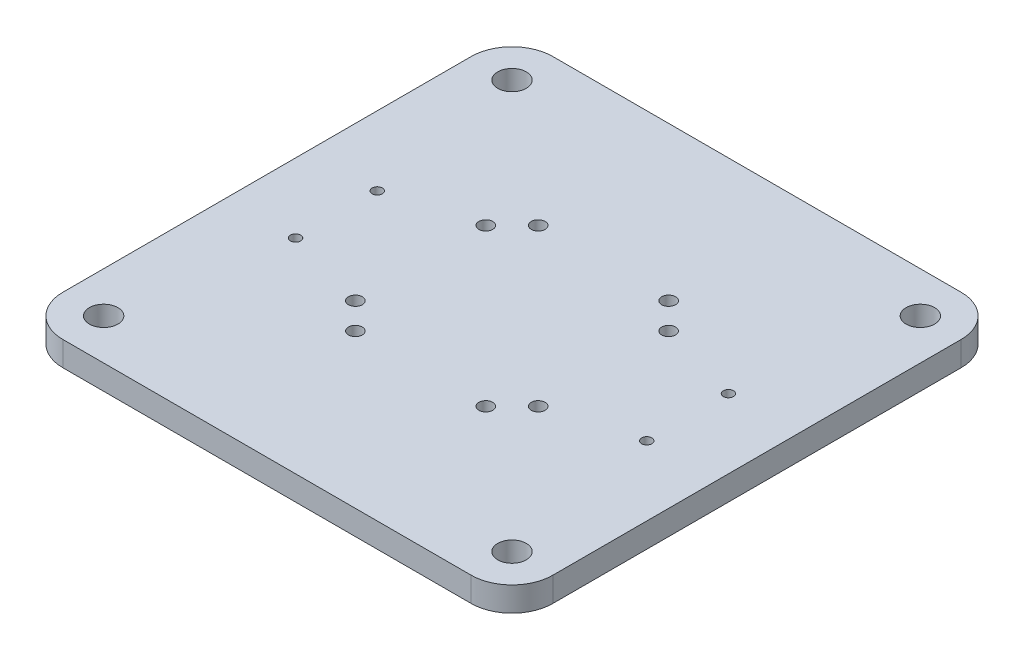
ISO-10303-21;
HEADER;
FILE_DESCRIPTION(('STEP AP214'),'2;1');
FILE_NAME('part.step','',(''),(''),'','','');
FILE_SCHEMA(('AUTOMOTIVE_DESIGN { 1 0 10303 214 1 1 1 1 }'));
ENDSEC;
DATA;
#1=APPLICATION_CONTEXT('core data for automotive mechanical design processes');
#2=APPLICATION_PROTOCOL_DEFINITION('international standard','automotive_design',2000,#1);
#3=PRODUCT_CONTEXT('',#1,'mechanical');
#4=PRODUCT('Part','Part','',(#3));
#5=PRODUCT_RELATED_PRODUCT_CATEGORY('part','',(#4));
#6=PRODUCT_DEFINITION_FORMATION('','',#4);
#7=PRODUCT_DEFINITION_CONTEXT('part definition',#1,'design');
#8=PRODUCT_DEFINITION('design','',#6,#7);
#9=PRODUCT_DEFINITION_SHAPE('','',#8);
#10=(LENGTH_UNIT() NAMED_UNIT(*) SI_UNIT(.MILLI.,.METRE.));
#11=(NAMED_UNIT(*) PLANE_ANGLE_UNIT() SI_UNIT($,.RADIAN.));
#12=(NAMED_UNIT(*) SI_UNIT($,.STERADIAN.) SOLID_ANGLE_UNIT());
#13=UNCERTAINTY_MEASURE_WITH_UNIT(LENGTH_MEASURE(1.E-05),#10,'distance_accuracy_value','');
#14=(GEOMETRIC_REPRESENTATION_CONTEXT(3) GLOBAL_UNCERTAINTY_ASSIGNED_CONTEXT((#13)) GLOBAL_UNIT_ASSIGNED_CONTEXT((#10,
#11,#12)) REPRESENTATION_CONTEXT('',''));
#15=CARTESIAN_POINT('',(0.,0.,0.));
#16=DIRECTION('',(0.,0.,1.));
#17=DIRECTION('',(1.,0.,0.));
#18=AXIS2_PLACEMENT_3D('',#15,#16,#17);
#19=CARTESIAN_POINT('',(0.,0.,0.));
#20=DIRECTION('',(0.,1.,0.));
#21=DIRECTION('',(0.,0.,1.));
#22=AXIS2_PLACEMENT_3D('',#19,#20,#21);
#23=PLANE('',#22);
#24=CARTESIAN_POINT('',(-43.,0.,10.));
#25=DIRECTION('',(0.,1.,0.));
#26=DIRECTION('',(0.,0.,1.));
#27=AXIS2_PLACEMENT_3D('',#24,#25,#26);
#28=CIRCLE('',#27,1.24999999999999);
#29=CARTESIAN_POINT('',(-43.,0.,11.25));
#30=VERTEX_POINT('',#29);
#31=EDGE_CURVE('E295',#30,#30,#28,.F.);
#32=ORIENTED_EDGE('',*,*,#31,.F.);
#33=EDGE_LOOP('',(#32));
#34=FACE_BOUND('',#33,.T.);
#35=CARTESIAN_POINT('',(43.,0.,-10.));
#36=DIRECTION('',(0.,1.,0.));
#37=DIRECTION('',(0.,0.,1.));
#38=AXIS2_PLACEMENT_3D('',#35,#36,#37);
#39=CIRCLE('',#38,1.24999999999999);
#40=CARTESIAN_POINT('',(43.,0.,-8.75000000000001));
#41=VERTEX_POINT('',#40);
#42=EDGE_CURVE('E283',#41,#41,#39,.F.);
#43=ORIENTED_EDGE('',*,*,#42,.F.);
#44=EDGE_LOOP('',(#43));
#45=FACE_BOUND('',#44,.T.);
#46=CARTESIAN_POINT('',(22.3881767547989,0.,15.9693312820506));
#47=DIRECTION('',(0.,-1.,0.));
#48=DIRECTION('',(0.,0.,-1.));
#49=AXIS2_PLACEMENT_3D('',#46,#47,#48);
#50=CIRCLE('',#49,3.3);
#51=CARTESIAN_POINT('',(22.3881767547989,0.,12.6693312820506));
#52=VERTEX_POINT('',#51);
#53=EDGE_CURVE('E258',#52,#52,#50,.T.);
#54=ORIENTED_EDGE('',*,*,#53,.F.);
#55=EDGE_LOOP('',(#54));
#56=FACE_BOUND('',#55,.T.);
#57=CARTESIAN_POINT('',(-22.3881767547988,0.,15.9693312820508));
#58=DIRECTION('',(0.,-1.,0.));
#59=DIRECTION('',(0.,0.,-1.));
#60=AXIS2_PLACEMENT_3D('',#57,#58,#59);
#61=CIRCLE('',#60,3.3);
#62=CARTESIAN_POINT('',(-22.3881767547988,0.,12.6693312820508));
#63=VERTEX_POINT('',#62);
#64=EDGE_CURVE('E231',#63,#63,#61,.T.);
#65=ORIENTED_EDGE('',*,*,#64,.F.);
#66=EDGE_LOOP('',(#65));
#67=FACE_BOUND('',#66,.T.);
#68=CARTESIAN_POINT('',(-50.,0.,50.));
#69=DIRECTION('',(0.,1.,0.));
#70=DIRECTION('',(0.,0.,1.));
#71=AXIS2_PLACEMENT_3D('',#68,#69,#70);
#72=CIRCLE('',#71,3.5);
#73=CARTESIAN_POINT('',(-50.,0.,53.5));
#74=VERTEX_POINT('',#73);
#75=EDGE_CURVE('E134',#74,#74,#72,.T.);
#76=ORIENTED_EDGE('',*,*,#75,.T.);
#77=EDGE_LOOP('',(#76));
#78=FACE_BOUND('',#77,.T.);
#79=CARTESIAN_POINT('',(50.,0.,50.));
#80=DIRECTION('',(0.,1.,0.));
#81=DIRECTION('',(0.,0.,1.));
#82=AXIS2_PLACEMENT_3D('',#79,#80,#81);
#83=CIRCLE('',#82,3.5);
#84=CARTESIAN_POINT('',(50.,0.,53.5));
#85=VERTEX_POINT('',#84);
#86=EDGE_CURVE('E140',#85,#85,#83,.T.);
#87=ORIENTED_EDGE('',*,*,#86,.T.);
#88=EDGE_LOOP('',(#87));
#89=FACE_BOUND('',#88,.T.);
#90=CARTESIAN_POINT('',(50.,0.,-50.));
#91=DIRECTION('',(0.,1.,0.));
#92=DIRECTION('',(0.,0.,1.));
#93=AXIS2_PLACEMENT_3D('',#90,#91,#92);
#94=CIRCLE('',#93,3.5);
#95=CARTESIAN_POINT('',(50.,0.,-46.5));
#96=VERTEX_POINT('',#95);
#97=EDGE_CURVE('E152',#96,#96,#94,.T.);
#98=ORIENTED_EDGE('',*,*,#97,.T.);
#99=EDGE_LOOP('',(#98));
#100=FACE_BOUND('',#99,.T.);
#101=CARTESIAN_POINT('',(-50.,0.,-50.));
#102=DIRECTION('',(0.,1.,0.));
#103=DIRECTION('',(0.,0.,1.));
#104=AXIS2_PLACEMENT_3D('',#101,#102,#103);
#105=CIRCLE('',#104,3.5);
#106=CARTESIAN_POINT('',(-50.,0.,-46.5));
#107=VERTEX_POINT('',#106);
#108=EDGE_CURVE('E149',#107,#107,#105,.T.);
#109=ORIENTED_EDGE('',*,*,#108,.T.);
#110=EDGE_LOOP('',(#109));
#111=FACE_BOUND('',#110,.T.);
#112=DIRECTION('',(0.,0.,-1.));
#113=VECTOR('',#112,1.);
#114=CARTESIAN_POINT('',(60.,0.,-60.));
#115=LINE('',#114,#113);
#116=CARTESIAN_POINT('',(60.,0.,50.));
#117=VERTEX_POINT('',#116);
#118=CARTESIAN_POINT('',(60.,0.,-50.));
#119=VERTEX_POINT('',#118);
#120=EDGE_CURVE('E124',#117,#119,#115,.T.);
#121=ORIENTED_EDGE('',*,*,#120,.F.);
#122=CARTESIAN_POINT('',(50.,0.,50.));
#123=DIRECTION('',(0.,1.,0.));
#124=DIRECTION('',(0.,0.,1.));
#125=AXIS2_PLACEMENT_3D('',#122,#123,#124);
#126=CIRCLE('',#125,10.);
#127=CARTESIAN_POINT('',(50.,0.,60.));
#128=VERTEX_POINT('',#127);
#129=EDGE_CURVE('E107',#117,#128,#126,.F.);
#130=ORIENTED_EDGE('',*,*,#129,.T.);
#131=DIRECTION('',(1.,0.,0.));
#132=VECTOR('',#131,1.);
#133=CARTESIAN_POINT('',(-60.,0.,60.));
#134=LINE('',#133,#132);
#135=CARTESIAN_POINT('',(-50.,0.,60.));
#136=VERTEX_POINT('',#135);
#137=EDGE_CURVE('E147',#136,#128,#134,.T.);
#138=ORIENTED_EDGE('',*,*,#137,.F.);
#139=CARTESIAN_POINT('',(-50.,0.,50.));
#140=DIRECTION('',(0.,1.,0.));
#141=DIRECTION('',(0.,0.,1.));
#142=AXIS2_PLACEMENT_3D('',#139,#140,#141);
#143=CIRCLE('',#142,10.);
#144=CARTESIAN_POINT('',(-60.,0.,50.));
#145=VERTEX_POINT('',#144);
#146=EDGE_CURVE('E118',#136,#145,#143,.F.);
#147=ORIENTED_EDGE('',*,*,#146,.T.);
#148=DIRECTION('',(0.,0.,1.));
#149=VECTOR('',#148,1.);
#150=CARTESIAN_POINT('',(-60.,0.,-60.));
#151=LINE('',#150,#149);
#152=CARTESIAN_POINT('',(-60.,0.,-50.));
#153=VERTEX_POINT('',#152);
#154=EDGE_CURVE('E137',#153,#145,#151,.T.);
#155=ORIENTED_EDGE('',*,*,#154,.F.);
#156=CARTESIAN_POINT('',(-50.,0.,-50.));
#157=DIRECTION('',(0.,1.,0.));
#158=DIRECTION('',(0.,0.,1.));
#159=AXIS2_PLACEMENT_3D('',#156,#157,#158);
#160=CIRCLE('',#159,10.);
#161=CARTESIAN_POINT('',(-50.,0.,-60.));
#162=VERTEX_POINT('',#161);
#163=EDGE_CURVE('E160',#153,#162,#160,.F.);
#164=ORIENTED_EDGE('',*,*,#163,.T.);
#165=DIRECTION('',(-1.,0.,0.));
#166=VECTOR('',#165,1.);
#167=CARTESIAN_POINT('',(-60.,0.,-60.));
#168=LINE('',#167,#166);
#169=CARTESIAN_POINT('',(50.,0.,-60.));
#170=VERTEX_POINT('',#169);
#171=EDGE_CURVE('E133',#170,#162,#168,.T.);
#172=ORIENTED_EDGE('',*,*,#171,.F.);
#173=CARTESIAN_POINT('',(50.,0.,-50.));
#174=DIRECTION('',(0.,1.,0.));
#175=DIRECTION('',(0.,0.,1.));
#176=AXIS2_PLACEMENT_3D('',#173,#174,#175);
#177=CIRCLE('',#176,10.);
#178=EDGE_CURVE('E128',#170,#119,#177,.F.);
#179=ORIENTED_EDGE('',*,*,#178,.T.);
#180=EDGE_LOOP('',(#121,#130,#138,#147,#155,#164,#172,#179));
#181=FACE_BOUND('',#180,.T.);
#182=CARTESIAN_POINT('',(-15.969331282051,0.,-22.3881767547986));
#183=DIRECTION('',(0.,-1.,0.));
#184=DIRECTION('',(0.,0.,-1.));
#185=AXIS2_PLACEMENT_3D('',#182,#183,#184);
#186=CIRCLE('',#185,3.3);
#187=CARTESIAN_POINT('',(-15.969331282051,0.,-25.6881767547986));
#188=VERTEX_POINT('',#187);
#189=EDGE_CURVE('E213',#188,#188,#186,.T.);
#190=ORIENTED_EDGE('',*,*,#189,.F.);
#191=EDGE_LOOP('',(#190));
#192=FACE_BOUND('',#191,.T.);
#193=CARTESIAN_POINT('',(-22.3881767547989,0.,-15.9693312820506));
#194=DIRECTION('',(0.,-1.,0.));
#195=DIRECTION('',(0.,0.,-1.));
#196=AXIS2_PLACEMENT_3D('',#193,#194,#195);
#197=CIRCLE('',#196,3.3);
#198=CARTESIAN_POINT('',(-22.3881767547989,0.,-19.2693312820506));
#199=VERTEX_POINT('',#198);
#200=EDGE_CURVE('E222',#199,#199,#197,.T.);
#201=ORIENTED_EDGE('',*,*,#200,.F.);
#202=EDGE_LOOP('',(#201));
#203=FACE_BOUND('',#202,.T.);
#204=CARTESIAN_POINT('',(-15.9693312820508,0.,22.3881767547988));
#205=DIRECTION('',(0.,-1.,0.));
#206=DIRECTION('',(0.,0.,-1.));
#207=AXIS2_PLACEMENT_3D('',#204,#205,#206);
#208=CIRCLE('',#207,3.3);
#209=CARTESIAN_POINT('',(-15.9693312820508,0.,19.0881767547988));
#210=VERTEX_POINT('',#209);
#211=EDGE_CURVE('E240',#210,#210,#208,.T.);
#212=ORIENTED_EDGE('',*,*,#211,.F.);
#213=EDGE_LOOP('',(#212));
#214=FACE_BOUND('',#213,.T.);
#215=CARTESIAN_POINT('',(15.969331282051,0.,22.3881767547986));
#216=DIRECTION('',(0.,-1.,0.));
#217=DIRECTION('',(0.,0.,-1.));
#218=AXIS2_PLACEMENT_3D('',#215,#216,#217);
#219=CIRCLE('',#218,3.3);
#220=CARTESIAN_POINT('',(15.969331282051,0.,19.0881767547986));
#221=VERTEX_POINT('',#220);
#222=EDGE_CURVE('E249',#221,#221,#219,.T.);
#223=ORIENTED_EDGE('',*,*,#222,.F.);
#224=EDGE_LOOP('',(#223));
#225=FACE_BOUND('',#224,.T.);
#226=CARTESIAN_POINT('',(22.3881767547988,0.,-15.9693312820508));
#227=DIRECTION('',(0.,-1.,0.));
#228=DIRECTION('',(0.,0.,-1.));
#229=AXIS2_PLACEMENT_3D('',#226,#227,#228);
#230=CIRCLE('',#229,3.3);
#231=CARTESIAN_POINT('',(22.3881767547988,0.,-19.2693312820508));
#232=VERTEX_POINT('',#231);
#233=EDGE_CURVE('E267',#232,#232,#230,.T.);
#234=ORIENTED_EDGE('',*,*,#233,.F.);
#235=EDGE_LOOP('',(#234));
#236=FACE_BOUND('',#235,.T.);
#237=CARTESIAN_POINT('',(15.9693312820508,0.,-22.3881767547988));
#238=DIRECTION('',(0.,-1.,0.));
#239=DIRECTION('',(0.,0.,-1.));
#240=AXIS2_PLACEMENT_3D('',#237,#238,#239);
#241=CIRCLE('',#240,3.3);
#242=CARTESIAN_POINT('',(15.9693312820508,0.,-25.6881767547988));
#243=VERTEX_POINT('',#242);
#244=EDGE_CURVE('E276',#243,#243,#241,.T.);
#245=ORIENTED_EDGE('',*,*,#244,.F.);
#246=EDGE_LOOP('',(#245));
#247=FACE_BOUND('',#246,.T.);
#248=CARTESIAN_POINT('',(43.,0.,10.));
#249=DIRECTION('',(0.,1.,0.));
#250=DIRECTION('',(0.,0.,1.));
#251=AXIS2_PLACEMENT_3D('',#248,#249,#250);
#252=CIRCLE('',#251,1.24999999999999);
#253=CARTESIAN_POINT('',(43.,0.,11.25));
#254=VERTEX_POINT('',#253);
#255=EDGE_CURVE('E279',#254,#254,#252,.F.);
#256=ORIENTED_EDGE('',*,*,#255,.F.);
#257=EDGE_LOOP('',(#256));
#258=FACE_BOUND('',#257,.T.);
#259=CARTESIAN_POINT('',(-43.,0.,-10.));
#260=DIRECTION('',(0.,1.,0.));
#261=DIRECTION('',(0.,0.,1.));
#262=AXIS2_PLACEMENT_3D('',#259,#260,#261);
#263=CIRCLE('',#262,1.24999999999999);
#264=CARTESIAN_POINT('',(-43.,0.,-8.75000000000001));
#265=VERTEX_POINT('',#264);
#266=EDGE_CURVE('E289',#265,#265,#263,.F.);
#267=ORIENTED_EDGE('',*,*,#266,.F.);
#268=EDGE_LOOP('',(#267));
#269=FACE_BOUND('',#268,.T.);
#270=ADVANCED_FACE('F41',(#34,#45,#56,#67,#78,#89,#100,#111,#181,#192,#203,#214,#225,#236,#247,
#258,#269),#23,.F.);
#271=CARTESIAN_POINT('',(60.,6.,-60.));
#272=DIRECTION('',(-1.,0.,0.));
#273=DIRECTION('',(0.,0.,1.));
#274=AXIS2_PLACEMENT_3D('',#271,#272,#273);
#275=PLANE('',#274);
#276=DIRECTION('',(0.,0.,-1.));
#277=VECTOR('',#276,1.);
#278=CARTESIAN_POINT('',(60.,6.,-60.));
#279=LINE('',#278,#277);
#280=CARTESIAN_POINT('',(60.,6.,50.));
#281=VERTEX_POINT('',#280);
#282=CARTESIAN_POINT('',(60.,6.,-50.));
#283=VERTEX_POINT('',#282);
#284=EDGE_CURVE('E127',#281,#283,#279,.T.);
#285=ORIENTED_EDGE('',*,*,#284,.F.);
#286=DIRECTION('',(0.,-1.,0.));
#287=VECTOR('',#286,1.);
#288=CARTESIAN_POINT('',(60.,6.,50.));
#289=LINE('',#288,#287);
#290=EDGE_CURVE('E111',#281,#117,#289,.T.);
#291=ORIENTED_EDGE('',*,*,#290,.T.);
#292=ORIENTED_EDGE('',*,*,#120,.T.);
#293=DIRECTION('',(0.,-1.,0.));
#294=VECTOR('',#293,1.);
#295=CARTESIAN_POINT('',(60.,6.,-50.));
#296=LINE('',#295,#294);
#297=EDGE_CURVE('E129',#119,#283,#296,.F.);
#298=ORIENTED_EDGE('',*,*,#297,.T.);
#299=EDGE_LOOP('',(#285,#291,#292,#298));
#300=FACE_BOUND('',#299,.T.);
#301=ADVANCED_FACE('F123',(#300),#275,.F.);
#302=CARTESIAN_POINT('',(-60.,6.,-60.));
#303=DIRECTION('',(0.,0.,1.));
#304=DIRECTION('',(1.,0.,0.));
#305=AXIS2_PLACEMENT_3D('',#302,#303,#304);
#306=PLANE('',#305);
#307=ORIENTED_EDGE('',*,*,#171,.T.);
#308=DIRECTION('',(0.,-1.,0.));
#309=VECTOR('',#308,1.);
#310=CARTESIAN_POINT('',(-50.,6.,-60.));
#311=LINE('',#310,#309);
#312=CARTESIAN_POINT('',(-50.,6.,-60.));
#313=VERTEX_POINT('',#312);
#314=EDGE_CURVE('E11',#162,#313,#311,.F.);
#315=ORIENTED_EDGE('',*,*,#314,.T.);
#316=DIRECTION('',(-1.,0.,0.));
#317=VECTOR('',#316,1.);
#318=CARTESIAN_POINT('',(-60.,6.,-60.));
#319=LINE('',#318,#317);
#320=CARTESIAN_POINT('',(50.,6.,-60.));
#321=VERTEX_POINT('',#320);
#322=EDGE_CURVE('E182',#321,#313,#319,.T.);
#323=ORIENTED_EDGE('',*,*,#322,.F.);
#324=DIRECTION('',(0.,-1.,0.));
#325=VECTOR('',#324,1.);
#326=CARTESIAN_POINT('',(50.,6.,-60.));
#327=LINE('',#326,#325);
#328=EDGE_CURVE('E49',#321,#170,#327,.T.);
#329=ORIENTED_EDGE('',*,*,#328,.T.);
#330=EDGE_LOOP('',(#307,#315,#323,#329));
#331=FACE_BOUND('',#330,.T.);
#332=ADVANCED_FACE('F180',(#331),#306,.F.);
#333=CARTESIAN_POINT('',(-60.,6.,-60.));
#334=DIRECTION('',(1.,0.,0.));
#335=DIRECTION('',(0.,0.,-1.));
#336=AXIS2_PLACEMENT_3D('',#333,#334,#335);
#337=PLANE('',#336);
#338=ORIENTED_EDGE('',*,*,#154,.T.);
#339=DIRECTION('',(0.,-1.,0.));
#340=VECTOR('',#339,1.);
#341=CARTESIAN_POINT('',(-60.,6.,50.));
#342=LINE('',#341,#340);
#343=CARTESIAN_POINT('',(-60.,6.,50.));
#344=VERTEX_POINT('',#343);
#345=EDGE_CURVE('E56',#145,#344,#342,.F.);
#346=ORIENTED_EDGE('',*,*,#345,.T.);
#347=DIRECTION('',(0.,0.,1.));
#348=VECTOR('',#347,1.);
#349=CARTESIAN_POINT('',(-60.,6.,-60.));
#350=LINE('',#349,#348);
#351=CARTESIAN_POINT('',(-60.,6.,-50.));
#352=VERTEX_POINT('',#351);
#353=EDGE_CURVE('E190',#352,#344,#350,.T.);
#354=ORIENTED_EDGE('',*,*,#353,.F.);
#355=DIRECTION('',(0.,-1.,0.));
#356=VECTOR('',#355,1.);
#357=CARTESIAN_POINT('',(-60.,6.,-50.));
#358=LINE('',#357,#356);
#359=EDGE_CURVE('E173',#352,#153,#358,.T.);
#360=ORIENTED_EDGE('',*,*,#359,.T.);
#361=EDGE_LOOP('',(#338,#346,#354,#360));
#362=FACE_BOUND('',#361,.T.);
#363=ADVANCED_FACE('F189',(#362),#337,.F.);
#364=CARTESIAN_POINT('',(-60.,6.,60.));
#365=DIRECTION('',(0.,0.,-1.));
#366=DIRECTION('',(-1.,0.,0.));
#367=AXIS2_PLACEMENT_3D('',#364,#365,#366);
#368=PLANE('',#367);
#369=ORIENTED_EDGE('',*,*,#137,.T.);
#370=DIRECTION('',(0.,-1.,0.));
#371=VECTOR('',#370,1.);
#372=CARTESIAN_POINT('',(50.,6.,60.));
#373=LINE('',#372,#371);
#374=CARTESIAN_POINT('',(50.,6.,60.));
#375=VERTEX_POINT('',#374);
#376=EDGE_CURVE('E112',#128,#375,#373,.F.);
#377=ORIENTED_EDGE('',*,*,#376,.T.);
#378=DIRECTION('',(1.,0.,0.));
#379=VECTOR('',#378,1.);
#380=CARTESIAN_POINT('',(-60.,6.,60.));
#381=LINE('',#380,#379);
#382=CARTESIAN_POINT('',(-50.,6.,60.));
#383=VERTEX_POINT('',#382);
#384=EDGE_CURVE('E143',#383,#375,#381,.T.);
#385=ORIENTED_EDGE('',*,*,#384,.F.);
#386=DIRECTION('',(0.,-1.,0.));
#387=VECTOR('',#386,1.);
#388=CARTESIAN_POINT('',(-50.,6.,60.));
#389=LINE('',#388,#387);
#390=EDGE_CURVE('E117',#383,#136,#389,.T.);
#391=ORIENTED_EDGE('',*,*,#390,.T.);
#392=EDGE_LOOP('',(#369,#377,#385,#391));
#393=FACE_BOUND('',#392,.T.);
#394=ADVANCED_FACE('F337',(#393),#368,.F.);
#395=CARTESIAN_POINT('',(0.,6.,0.));
#396=DIRECTION('',(0.,1.,0.));
#397=DIRECTION('',(0.,0.,1.));
#398=AXIS2_PLACEMENT_3D('',#395,#396,#397);
#399=PLANE('',#398);
#400=CARTESIAN_POINT('',(-43.,6.,10.));
#401=DIRECTION('',(0.,1.,0.));
#402=DIRECTION('',(0.,0.,1.));
#403=AXIS2_PLACEMENT_3D('',#400,#401,#402);
#404=CIRCLE('',#403,1.24999999999999);
#405=CARTESIAN_POINT('',(-43.,6.,11.25));
#406=VERTEX_POINT('',#405);
#407=EDGE_CURVE('E298',#406,#406,#404,.T.);
#408=ORIENTED_EDGE('',*,*,#407,.F.);
#409=EDGE_LOOP('',(#408));
#410=FACE_BOUND('',#409,.T.);
#411=CARTESIAN_POINT('',(-43.,6.,-10.));
#412=DIRECTION('',(0.,1.,0.));
#413=DIRECTION('',(0.,0.,1.));
#414=AXIS2_PLACEMENT_3D('',#411,#412,#413);
#415=CIRCLE('',#414,1.24999999999999);
#416=CARTESIAN_POINT('',(-43.,6.,-8.75000000000001));
#417=VERTEX_POINT('',#416);
#418=EDGE_CURVE('E292',#417,#417,#415,.T.);
#419=ORIENTED_EDGE('',*,*,#418,.F.);
#420=EDGE_LOOP('',(#419));
#421=FACE_BOUND('',#420,.T.);
#422=CARTESIAN_POINT('',(43.,6.,-10.));
#423=DIRECTION('',(0.,1.,0.));
#424=DIRECTION('',(0.,0.,1.));
#425=AXIS2_PLACEMENT_3D('',#422,#423,#424);
#426=CIRCLE('',#425,1.24999999999999);
#427=CARTESIAN_POINT('',(43.,6.,-8.75000000000001));
#428=VERTEX_POINT('',#427);
#429=EDGE_CURVE('E286',#428,#428,#426,.T.);
#430=ORIENTED_EDGE('',*,*,#429,.F.);
#431=EDGE_LOOP('',(#430));
#432=FACE_BOUND('',#431,.T.);
#433=CARTESIAN_POINT('',(43.,6.,10.));
#434=DIRECTION('',(0.,1.,0.));
#435=DIRECTION('',(0.,0.,1.));
#436=AXIS2_PLACEMENT_3D('',#433,#434,#435);
#437=CIRCLE('',#436,1.24999999999999);
#438=CARTESIAN_POINT('',(43.,6.,11.25));
#439=VERTEX_POINT('',#438);
#440=EDGE_CURVE('E280',#439,#439,#437,.T.);
#441=ORIENTED_EDGE('',*,*,#440,.F.);
#442=EDGE_LOOP('',(#441));
#443=FACE_BOUND('',#442,.T.);
#444=CARTESIAN_POINT('',(15.9693312820508,6.,-22.3881767547988));
#445=DIRECTION('',(0.,1.,0.));
#446=DIRECTION('',(0.,0.,1.));
#447=AXIS2_PLACEMENT_3D('',#444,#445,#446);
#448=CIRCLE('',#447,1.7);
#449=CARTESIAN_POINT('',(15.9693312820508,6.,-20.6881767547988));
#450=VERTEX_POINT('',#449);
#451=EDGE_CURVE('E270',#450,#450,#448,.T.);
#452=ORIENTED_EDGE('',*,*,#451,.F.);
#453=EDGE_LOOP('',(#452));
#454=FACE_BOUND('',#453,.T.);
#455=CARTESIAN_POINT('',(22.3881767547988,6.,-15.9693312820508));
#456=DIRECTION('',(0.,1.,0.));
#457=DIRECTION('',(0.,0.,1.));
#458=AXIS2_PLACEMENT_3D('',#455,#456,#457);
#459=CIRCLE('',#458,1.7);
#460=CARTESIAN_POINT('',(22.3881767547988,6.,-14.2693312820508));
#461=VERTEX_POINT('',#460);
#462=EDGE_CURVE('E261',#461,#461,#459,.T.);
#463=ORIENTED_EDGE('',*,*,#462,.F.);
#464=EDGE_LOOP('',(#463));
#465=FACE_BOUND('',#464,.T.);
#466=CARTESIAN_POINT('',(22.3881767547989,6.,15.9693312820506));
#467=DIRECTION('',(0.,1.,0.));
#468=DIRECTION('',(0.,0.,1.));
#469=AXIS2_PLACEMENT_3D('',#466,#467,#468);
#470=CIRCLE('',#469,1.7);
#471=CARTESIAN_POINT('',(22.3881767547989,6.,17.6693312820506));
#472=VERTEX_POINT('',#471);
#473=EDGE_CURVE('E252',#472,#472,#470,.T.);
#474=ORIENTED_EDGE('',*,*,#473,.F.);
#475=EDGE_LOOP('',(#474));
#476=FACE_BOUND('',#475,.T.);
#477=CARTESIAN_POINT('',(15.969331282051,6.,22.3881767547986));
#478=DIRECTION('',(0.,1.,0.));
#479=DIRECTION('',(0.,0.,1.));
#480=AXIS2_PLACEMENT_3D('',#477,#478,#479);
#481=CIRCLE('',#480,1.7);
#482=CARTESIAN_POINT('',(15.969331282051,6.,24.0881767547986));
#483=VERTEX_POINT('',#482);
#484=EDGE_CURVE('E243',#483,#483,#481,.T.);
#485=ORIENTED_EDGE('',*,*,#484,.F.);
#486=EDGE_LOOP('',(#485));
#487=FACE_BOUND('',#486,.T.);
#488=CARTESIAN_POINT('',(-15.9693312820508,6.,22.3881767547988));
#489=DIRECTION('',(0.,1.,0.));
#490=DIRECTION('',(0.,0.,1.));
#491=AXIS2_PLACEMENT_3D('',#488,#489,#490);
#492=CIRCLE('',#491,1.7);
#493=CARTESIAN_POINT('',(-15.9693312820508,6.,24.0881767547988));
#494=VERTEX_POINT('',#493);
#495=EDGE_CURVE('E234',#494,#494,#492,.T.);
#496=ORIENTED_EDGE('',*,*,#495,.F.);
#497=EDGE_LOOP('',(#496));
#498=FACE_BOUND('',#497,.T.);
#499=CARTESIAN_POINT('',(-22.3881767547988,6.,15.9693312820508));
#500=DIRECTION('',(0.,1.,0.));
#501=DIRECTION('',(0.,0.,1.));
#502=AXIS2_PLACEMENT_3D('',#499,#500,#501);
#503=CIRCLE('',#502,1.7);
#504=CARTESIAN_POINT('',(-22.3881767547988,6.,17.6693312820508));
#505=VERTEX_POINT('',#504);
#506=EDGE_CURVE('E225',#505,#505,#503,.T.);
#507=ORIENTED_EDGE('',*,*,#506,.F.);
#508=EDGE_LOOP('',(#507));
#509=FACE_BOUND('',#508,.T.);
#510=CARTESIAN_POINT('',(-22.3881767547989,6.,-15.9693312820506));
#511=DIRECTION('',(0.,1.,0.));
#512=DIRECTION('',(0.,0.,1.));
#513=AXIS2_PLACEMENT_3D('',#510,#511,#512);
#514=CIRCLE('',#513,1.7);
#515=CARTESIAN_POINT('',(-22.3881767547989,6.,-14.2693312820506));
#516=VERTEX_POINT('',#515);
#517=EDGE_CURVE('E216',#516,#516,#514,.T.);
#518=ORIENTED_EDGE('',*,*,#517,.F.);
#519=EDGE_LOOP('',(#518));
#520=FACE_BOUND('',#519,.T.);
#521=CARTESIAN_POINT('',(-15.969331282051,6.,-22.3881767547986));
#522=DIRECTION('',(0.,1.,0.));
#523=DIRECTION('',(0.,0.,1.));
#524=AXIS2_PLACEMENT_3D('',#521,#522,#523);
#525=CIRCLE('',#524,1.7);
#526=CARTESIAN_POINT('',(-15.969331282051,6.,-20.6881767547986));
#527=VERTEX_POINT('',#526);
#528=EDGE_CURVE('E203',#527,#527,#525,.T.);
#529=ORIENTED_EDGE('',*,*,#528,.F.);
#530=EDGE_LOOP('',(#529));
#531=FACE_BOUND('',#530,.T.);
#532=CARTESIAN_POINT('',(-50.,6.,50.));
#533=DIRECTION('',(0.,1.,0.));
#534=DIRECTION('',(0.,0.,-1.));
#535=AXIS2_PLACEMENT_3D('',#532,#533,#534);
#536=CIRCLE('',#535,3.5);
#537=CARTESIAN_POINT('',(-50.,6.,46.5));
#538=VERTEX_POINT('',#537);
#539=EDGE_CURVE('E199',#538,#538,#536,.T.);
#540=ORIENTED_EDGE('',*,*,#539,.F.);
#541=EDGE_LOOP('',(#540));
#542=FACE_BOUND('',#541,.T.);
#543=CARTESIAN_POINT('',(50.,6.,50.));
#544=DIRECTION('',(0.,1.,0.));
#545=DIRECTION('',(0.,0.,1.));
#546=AXIS2_PLACEMENT_3D('',#543,#544,#545);
#547=CIRCLE('',#546,3.5);
#548=CARTESIAN_POINT('',(50.,6.,53.5));
#549=VERTEX_POINT('',#548);
#550=EDGE_CURVE('E202',#549,#549,#547,.T.);
#551=ORIENTED_EDGE('',*,*,#550,.F.);
#552=EDGE_LOOP('',(#551));
#553=FACE_BOUND('',#552,.T.);
#554=CARTESIAN_POINT('',(50.,6.,-50.));
#555=DIRECTION('',(0.,1.,0.));
#556=DIRECTION('',(0.,0.,-1.));
#557=AXIS2_PLACEMENT_3D('',#554,#555,#556);
#558=CIRCLE('',#557,3.5);
#559=CARTESIAN_POINT('',(50.,6.,-53.5));
#560=VERTEX_POINT('',#559);
#561=EDGE_CURVE('E198',#560,#560,#558,.T.);
#562=ORIENTED_EDGE('',*,*,#561,.F.);
#563=EDGE_LOOP('',(#562));
#564=FACE_BOUND('',#563,.T.);
#565=CARTESIAN_POINT('',(-50.,6.,-50.));
#566=DIRECTION('',(0.,1.,0.));
#567=DIRECTION('',(0.,0.,1.));
#568=AXIS2_PLACEMENT_3D('',#565,#566,#567);
#569=CIRCLE('',#568,3.5);
#570=CARTESIAN_POINT('',(-50.,6.,-46.5));
#571=VERTEX_POINT('',#570);
#572=EDGE_CURVE('E153',#571,#571,#569,.T.);
#573=ORIENTED_EDGE('',*,*,#572,.F.);
#574=EDGE_LOOP('',(#573));
#575=FACE_BOUND('',#574,.T.);
#576=ORIENTED_EDGE('',*,*,#384,.T.);
#577=CARTESIAN_POINT('',(50.,6.,50.));
#578=DIRECTION('',(0.,1.,0.));
#579=DIRECTION('',(0.,0.,1.));
#580=AXIS2_PLACEMENT_3D('',#577,#578,#579);
#581=CIRCLE('',#580,10.);
#582=EDGE_CURVE('E171',#375,#281,#581,.T.);
#583=ORIENTED_EDGE('',*,*,#582,.T.);
#584=ORIENTED_EDGE('',*,*,#284,.T.);
#585=CARTESIAN_POINT('',(50.,6.,-50.));
#586=DIRECTION('',(0.,1.,0.));
#587=DIRECTION('',(0.,0.,1.));
#588=AXIS2_PLACEMENT_3D('',#585,#586,#587);
#589=CIRCLE('',#588,10.);
#590=EDGE_CURVE('E166',#283,#321,#589,.T.);
#591=ORIENTED_EDGE('',*,*,#590,.T.);
#592=ORIENTED_EDGE('',*,*,#322,.T.);
#593=CARTESIAN_POINT('',(-50.,6.,-50.));
#594=DIRECTION('',(0.,1.,0.));
#595=DIRECTION('',(0.,0.,1.));
#596=AXIS2_PLACEMENT_3D('',#593,#594,#595);
#597=CIRCLE('',#596,10.);
#598=EDGE_CURVE('E63',#313,#352,#597,.T.);
#599=ORIENTED_EDGE('',*,*,#598,.T.);
#600=ORIENTED_EDGE('',*,*,#353,.T.);
#601=CARTESIAN_POINT('',(-50.,6.,50.));
#602=DIRECTION('',(0.,1.,0.));
#603=DIRECTION('',(0.,0.,1.));
#604=AXIS2_PLACEMENT_3D('',#601,#602,#603);
#605=CIRCLE('',#604,10.);
#606=EDGE_CURVE('E169',#344,#383,#605,.T.);
#607=ORIENTED_EDGE('',*,*,#606,.T.);
#608=EDGE_LOOP('',(#576,#583,#584,#591,#592,#599,#600,#607));
#609=FACE_BOUND('',#608,.T.);
#610=ADVANCED_FACE('F327',(#410,#421,#432,#443,#454,#465,#476,#487,#498,#509,#520,#531,#542,
#553,#564,#575,#609),#399,.T.);
#611=CARTESIAN_POINT('',(-50.,-4.,-50.));
#612=DIRECTION('',(0.,1.,0.));
#613=DIRECTION('',(0.,0.,1.));
#614=AXIS2_PLACEMENT_3D('',#611,#612,#613);
#615=CYLINDRICAL_SURFACE('',#614,3.5);
#616=ORIENTED_EDGE('',*,*,#572,.T.);
#617=EDGE_LOOP('',(#616));
#618=FACE_BOUND('',#617,.T.);
#619=ORIENTED_EDGE('',*,*,#108,.F.);
#620=EDGE_LOOP('',(#619));
#621=FACE_BOUND('',#620,.T.);
#622=ADVANCED_FACE('F324',(#618,#621),#615,.F.);
#623=CARTESIAN_POINT('',(50.,-4.,-50.));
#624=DIRECTION('',(0.,1.,0.));
#625=DIRECTION('',(0.,0.,1.));
#626=AXIS2_PLACEMENT_3D('',#623,#624,#625);
#627=CYLINDRICAL_SURFACE('',#626,3.5);
#628=ORIENTED_EDGE('',*,*,#561,.T.);
#629=EDGE_LOOP('',(#628));
#630=FACE_BOUND('',#629,.T.);
#631=ORIENTED_EDGE('',*,*,#97,.F.);
#632=EDGE_LOOP('',(#631));
#633=FACE_BOUND('',#632,.T.);
#634=ADVANCED_FACE('F326',(#630,#633),#627,.F.);
#635=CARTESIAN_POINT('',(50.,-4.,50.));
#636=DIRECTION('',(0.,1.,0.));
#637=DIRECTION('',(0.,0.,1.));
#638=AXIS2_PLACEMENT_3D('',#635,#636,#637);
#639=CYLINDRICAL_SURFACE('',#638,3.5);
#640=ORIENTED_EDGE('',*,*,#550,.T.);
#641=EDGE_LOOP('',(#640));
#642=FACE_BOUND('',#641,.T.);
#643=ORIENTED_EDGE('',*,*,#86,.F.);
#644=EDGE_LOOP('',(#643));
#645=FACE_BOUND('',#644,.T.);
#646=ADVANCED_FACE('F333',(#642,#645),#639,.F.);
#647=CARTESIAN_POINT('',(-50.,-4.,50.));
#648=DIRECTION('',(0.,1.,0.));
#649=DIRECTION('',(0.,0.,1.));
#650=AXIS2_PLACEMENT_3D('',#647,#648,#649);
#651=CYLINDRICAL_SURFACE('',#650,3.5);
#652=ORIENTED_EDGE('',*,*,#539,.T.);
#653=EDGE_LOOP('',(#652));
#654=FACE_BOUND('',#653,.T.);
#655=ORIENTED_EDGE('',*,*,#75,.F.);
#656=EDGE_LOOP('',(#655));
#657=FACE_BOUND('',#656,.T.);
#658=ADVANCED_FACE('F341',(#654,#657),#651,.F.);
#659=CARTESIAN_POINT('',(50.,6.,50.));
#660=DIRECTION('',(0.,-1.,0.));
#661=DIRECTION('',(0.,0.,-1.));
#662=AXIS2_PLACEMENT_3D('',#659,#660,#661);
#663=CYLINDRICAL_SURFACE('',#662,10.);
#664=ORIENTED_EDGE('',*,*,#582,.F.);
#665=ORIENTED_EDGE('',*,*,#376,.F.);
#666=ORIENTED_EDGE('',*,*,#129,.F.);
#667=ORIENTED_EDGE('',*,*,#290,.F.);
#668=EDGE_LOOP('',(#664,#665,#666,#667));
#669=FACE_BOUND('',#668,.T.);
#670=ADVANCED_FACE('F110',(#669),#663,.T.);
#671=CARTESIAN_POINT('',(-50.,6.,50.));
#672=DIRECTION('',(0.,-1.,0.));
#673=DIRECTION('',(0.,0.,-1.));
#674=AXIS2_PLACEMENT_3D('',#671,#672,#673);
#675=CYLINDRICAL_SURFACE('',#674,10.);
#676=ORIENTED_EDGE('',*,*,#606,.F.);
#677=ORIENTED_EDGE('',*,*,#345,.F.);
#678=ORIENTED_EDGE('',*,*,#146,.F.);
#679=ORIENTED_EDGE('',*,*,#390,.F.);
#680=EDGE_LOOP('',(#676,#677,#678,#679));
#681=FACE_BOUND('',#680,.T.);
#682=ADVANCED_FACE('F355',(#681),#675,.T.);
#683=CARTESIAN_POINT('',(-50.,6.,-50.));
#684=DIRECTION('',(0.,-1.,0.));
#685=DIRECTION('',(0.,0.,-1.));
#686=AXIS2_PLACEMENT_3D('',#683,#684,#685);
#687=CYLINDRICAL_SURFACE('',#686,10.);
#688=ORIENTED_EDGE('',*,*,#598,.F.);
#689=ORIENTED_EDGE('',*,*,#314,.F.);
#690=ORIENTED_EDGE('',*,*,#163,.F.);
#691=ORIENTED_EDGE('',*,*,#359,.F.);
#692=EDGE_LOOP('',(#688,#689,#690,#691));
#693=FACE_BOUND('',#692,.T.);
#694=ADVANCED_FACE('F188',(#693),#687,.T.);
#695=CARTESIAN_POINT('',(50.,6.,-50.));
#696=DIRECTION('',(0.,-1.,0.));
#697=DIRECTION('',(0.,0.,-1.));
#698=AXIS2_PLACEMENT_3D('',#695,#696,#697);
#699=CYLINDRICAL_SURFACE('',#698,10.);
#700=ORIENTED_EDGE('',*,*,#590,.F.);
#701=ORIENTED_EDGE('',*,*,#297,.F.);
#702=ORIENTED_EDGE('',*,*,#178,.F.);
#703=ORIENTED_EDGE('',*,*,#328,.F.);
#704=EDGE_LOOP('',(#700,#701,#702,#703));
#705=FACE_BOUND('',#704,.T.);
#706=ADVANCED_FACE('F43',(#705),#699,.T.);
#707=CARTESIAN_POINT('',(-15.969331282051,0.,-22.3881767547986));
#708=DIRECTION('',(0.,-1.,0.));
#709=DIRECTION('',(0.,0.,-1.));
#710=AXIS2_PLACEMENT_3D('',#707,#708,#709);
#711=CYLINDRICAL_SURFACE('',#710,1.7);
#712=CARTESIAN_POINT('',(-15.969331282051,1.6,-22.3881767547986));
#713=DIRECTION('',(0.,-1.,0.));
#714=DIRECTION('',(0.,0.,-1.));
#715=AXIS2_PLACEMENT_3D('',#712,#713,#714);
#716=CIRCLE('',#715,1.7);
#717=CARTESIAN_POINT('',(-15.969331282051,1.6,-24.0881767547986));
#718=VERTEX_POINT('',#717);
#719=EDGE_CURVE('E210',#718,#718,#716,.T.);
#720=ORIENTED_EDGE('',*,*,#719,.T.);
#721=EDGE_LOOP('',(#720));
#722=FACE_BOUND('',#721,.T.);
#723=ORIENTED_EDGE('',*,*,#528,.T.);
#724=EDGE_LOOP('',(#723));
#725=FACE_BOUND('',#724,.T.);
#726=ADVANCED_FACE('F362',(#722,#725),#711,.F.);
#727=CARTESIAN_POINT('',(-15.969331282051,0.,-22.3881767547986));
#728=DIRECTION('',(0.,-1.,0.));
#729=DIRECTION('',(0.,0.,-1.));
#730=AXIS2_PLACEMENT_3D('',#727,#728,#729);
#731=CONICAL_SURFACE('',#730,3.3,0.785398163397449);
#732=ORIENTED_EDGE('',*,*,#719,.F.);
#733=EDGE_LOOP('',(#732));
#734=FACE_BOUND('',#733,.T.);
#735=ORIENTED_EDGE('',*,*,#189,.T.);
#736=EDGE_LOOP('',(#735));
#737=FACE_BOUND('',#736,.T.);
#738=ADVANCED_FACE('F366',(#734,#737),#731,.F.);
#739=CARTESIAN_POINT('',(-22.3881767547989,0.,-15.9693312820506));
#740=DIRECTION('',(0.,-1.,0.));
#741=DIRECTION('',(0.,0.,-1.));
#742=AXIS2_PLACEMENT_3D('',#739,#740,#741);
#743=CYLINDRICAL_SURFACE('',#742,1.7);
#744=CARTESIAN_POINT('',(-22.3881767547989,1.6,-15.9693312820506));
#745=DIRECTION('',(0.,-1.,0.));
#746=DIRECTION('',(0.,0.,-1.));
#747=AXIS2_PLACEMENT_3D('',#744,#745,#746);
#748=CIRCLE('',#747,1.7);
#749=CARTESIAN_POINT('',(-22.3881767547989,1.6,-17.6693312820506));
#750=VERTEX_POINT('',#749);
#751=EDGE_CURVE('E219',#750,#750,#748,.T.);
#752=ORIENTED_EDGE('',*,*,#751,.T.);
#753=EDGE_LOOP('',(#752));
#754=FACE_BOUND('',#753,.T.);
#755=ORIENTED_EDGE('',*,*,#517,.T.);
#756=EDGE_LOOP('',(#755));
#757=FACE_BOUND('',#756,.T.);
#758=ADVANCED_FACE('F374',(#754,#757),#743,.F.);
#759=CARTESIAN_POINT('',(-22.3881767547989,0.,-15.9693312820506));
#760=DIRECTION('',(0.,-1.,0.));
#761=DIRECTION('',(0.,0.,-1.));
#762=AXIS2_PLACEMENT_3D('',#759,#760,#761);
#763=CONICAL_SURFACE('',#762,3.3,0.785398163397448);
#764=ORIENTED_EDGE('',*,*,#751,.F.);
#765=EDGE_LOOP('',(#764));
#766=FACE_BOUND('',#765,.T.);
#767=ORIENTED_EDGE('',*,*,#200,.T.);
#768=EDGE_LOOP('',(#767));
#769=FACE_BOUND('',#768,.T.);
#770=ADVANCED_FACE('F457',(#766,#769),#763,.F.);
#771=CARTESIAN_POINT('',(-22.3881767547988,0.,15.9693312820508));
#772=DIRECTION('',(0.,-1.,0.));
#773=DIRECTION('',(0.,0.,-1.));
#774=AXIS2_PLACEMENT_3D('',#771,#772,#773);
#775=CYLINDRICAL_SURFACE('',#774,1.7);
#776=CARTESIAN_POINT('',(-22.3881767547988,1.6,15.9693312820508));
#777=DIRECTION('',(0.,-1.,0.));
#778=DIRECTION('',(0.,0.,-1.));
#779=AXIS2_PLACEMENT_3D('',#776,#777,#778);
#780=CIRCLE('',#779,1.7);
#781=CARTESIAN_POINT('',(-22.3881767547988,1.6,14.2693312820508));
#782=VERTEX_POINT('',#781);
#783=EDGE_CURVE('E228',#782,#782,#780,.T.);
#784=ORIENTED_EDGE('',*,*,#783,.T.);
#785=EDGE_LOOP('',(#784));
#786=FACE_BOUND('',#785,.T.);
#787=ORIENTED_EDGE('',*,*,#506,.T.);
#788=EDGE_LOOP('',(#787));
#789=FACE_BOUND('',#788,.T.);
#790=ADVANCED_FACE('F466',(#786,#789),#775,.F.);
#791=CARTESIAN_POINT('',(-22.3881767547988,0.,15.9693312820508));
#792=DIRECTION('',(0.,-1.,0.));
#793=DIRECTION('',(0.,0.,-1.));
#794=AXIS2_PLACEMENT_3D('',#791,#792,#793);
#795=CONICAL_SURFACE('',#794,3.3,0.785398163397448);
#796=ORIENTED_EDGE('',*,*,#783,.F.);
#797=EDGE_LOOP('',(#796));
#798=FACE_BOUND('',#797,.T.);
#799=ORIENTED_EDGE('',*,*,#64,.T.);
#800=EDGE_LOOP('',(#799));
#801=FACE_BOUND('',#800,.T.);
#802=ADVANCED_FACE('F476',(#798,#801),#795,.F.);
#803=CARTESIAN_POINT('',(-15.9693312820508,0.,22.3881767547988));
#804=DIRECTION('',(0.,-1.,0.));
#805=DIRECTION('',(0.,0.,-1.));
#806=AXIS2_PLACEMENT_3D('',#803,#804,#805);
#807=CYLINDRICAL_SURFACE('',#806,1.7);
#808=CARTESIAN_POINT('',(-15.9693312820508,1.6,22.3881767547988));
#809=DIRECTION('',(0.,-1.,0.));
#810=DIRECTION('',(0.,0.,-1.));
#811=AXIS2_PLACEMENT_3D('',#808,#809,#810);
#812=CIRCLE('',#811,1.7);
#813=CARTESIAN_POINT('',(-15.9693312820508,1.6,20.6881767547988));
#814=VERTEX_POINT('',#813);
#815=EDGE_CURVE('E237',#814,#814,#812,.T.);
#816=ORIENTED_EDGE('',*,*,#815,.T.);
#817=EDGE_LOOP('',(#816));
#818=FACE_BOUND('',#817,.T.);
#819=ORIENTED_EDGE('',*,*,#495,.T.);
#820=EDGE_LOOP('',(#819));
#821=FACE_BOUND('',#820,.T.);
#822=ADVANCED_FACE('F486',(#818,#821),#807,.F.);
#823=CARTESIAN_POINT('',(-15.9693312820508,0.,22.3881767547988));
#824=DIRECTION('',(0.,-1.,0.));
#825=DIRECTION('',(0.,0.,-1.));
#826=AXIS2_PLACEMENT_3D('',#823,#824,#825);
#827=CONICAL_SURFACE('',#826,3.3,0.785398163397449);
#828=ORIENTED_EDGE('',*,*,#815,.F.);
#829=EDGE_LOOP('',(#828));
#830=FACE_BOUND('',#829,.T.);
#831=ORIENTED_EDGE('',*,*,#211,.T.);
#832=EDGE_LOOP('',(#831));
#833=FACE_BOUND('',#832,.T.);
#834=ADVANCED_FACE('F496',(#830,#833),#827,.F.);
#835=CARTESIAN_POINT('',(15.969331282051,0.,22.3881767547986));
#836=DIRECTION('',(0.,-1.,0.));
#837=DIRECTION('',(0.,0.,-1.));
#838=AXIS2_PLACEMENT_3D('',#835,#836,#837);
#839=CYLINDRICAL_SURFACE('',#838,1.7);
#840=CARTESIAN_POINT('',(15.969331282051,1.6,22.3881767547986));
#841=DIRECTION('',(0.,-1.,0.));
#842=DIRECTION('',(0.,0.,-1.));
#843=AXIS2_PLACEMENT_3D('',#840,#841,#842);
#844=CIRCLE('',#843,1.7);
#845=CARTESIAN_POINT('',(15.969331282051,1.6,20.6881767547986));
#846=VERTEX_POINT('',#845);
#847=EDGE_CURVE('E246',#846,#846,#844,.T.);
#848=ORIENTED_EDGE('',*,*,#847,.T.);
#849=EDGE_LOOP('',(#848));
#850=FACE_BOUND('',#849,.T.);
#851=ORIENTED_EDGE('',*,*,#484,.T.);
#852=EDGE_LOOP('',(#851));
#853=FACE_BOUND('',#852,.T.);
#854=ADVANCED_FACE('F506',(#850,#853),#839,.F.);
#855=CARTESIAN_POINT('',(15.969331282051,0.,22.3881767547986));
#856=DIRECTION('',(0.,-1.,0.));
#857=DIRECTION('',(0.,0.,-1.));
#858=AXIS2_PLACEMENT_3D('',#855,#856,#857);
#859=CONICAL_SURFACE('',#858,3.3,0.785398163397448);
#860=ORIENTED_EDGE('',*,*,#847,.F.);
#861=EDGE_LOOP('',(#860));
#862=FACE_BOUND('',#861,.T.);
#863=ORIENTED_EDGE('',*,*,#222,.T.);
#864=EDGE_LOOP('',(#863));
#865=FACE_BOUND('',#864,.T.);
#866=ADVANCED_FACE('F516',(#862,#865),#859,.F.);
#867=CARTESIAN_POINT('',(22.3881767547989,0.,15.9693312820506));
#868=DIRECTION('',(0.,-1.,0.));
#869=DIRECTION('',(0.,0.,-1.));
#870=AXIS2_PLACEMENT_3D('',#867,#868,#869);
#871=CYLINDRICAL_SURFACE('',#870,1.7);
#872=CARTESIAN_POINT('',(22.3881767547989,1.6,15.9693312820506));
#873=DIRECTION('',(0.,-1.,0.));
#874=DIRECTION('',(0.,0.,-1.));
#875=AXIS2_PLACEMENT_3D('',#872,#873,#874);
#876=CIRCLE('',#875,1.7);
#877=CARTESIAN_POINT('',(22.3881767547989,1.6,14.2693312820506));
#878=VERTEX_POINT('',#877);
#879=EDGE_CURVE('E255',#878,#878,#876,.T.);
#880=ORIENTED_EDGE('',*,*,#879,.T.);
#881=EDGE_LOOP('',(#880));
#882=FACE_BOUND('',#881,.T.);
#883=ORIENTED_EDGE('',*,*,#473,.T.);
#884=EDGE_LOOP('',(#883));
#885=FACE_BOUND('',#884,.T.);
#886=ADVANCED_FACE('F526',(#882,#885),#871,.F.);
#887=CARTESIAN_POINT('',(22.3881767547989,0.,15.9693312820506));
#888=DIRECTION('',(0.,-1.,0.));
#889=DIRECTION('',(0.,0.,-1.));
#890=AXIS2_PLACEMENT_3D('',#887,#888,#889);
#891=CONICAL_SURFACE('',#890,3.3,0.785398163397448);
#892=ORIENTED_EDGE('',*,*,#879,.F.);
#893=EDGE_LOOP('',(#892));
#894=FACE_BOUND('',#893,.T.);
#895=ORIENTED_EDGE('',*,*,#53,.T.);
#896=EDGE_LOOP('',(#895));
#897=FACE_BOUND('',#896,.T.);
#898=ADVANCED_FACE('F536',(#894,#897),#891,.F.);
#899=CARTESIAN_POINT('',(22.3881767547988,0.,-15.9693312820508));
#900=DIRECTION('',(0.,-1.,0.));
#901=DIRECTION('',(0.,0.,-1.));
#902=AXIS2_PLACEMENT_3D('',#899,#900,#901);
#903=CYLINDRICAL_SURFACE('',#902,1.7);
#904=CARTESIAN_POINT('',(22.3881767547988,1.6,-15.9693312820508));
#905=DIRECTION('',(0.,-1.,0.));
#906=DIRECTION('',(0.,0.,-1.));
#907=AXIS2_PLACEMENT_3D('',#904,#905,#906);
#908=CIRCLE('',#907,1.7);
#909=CARTESIAN_POINT('',(22.3881767547988,1.6,-17.6693312820508));
#910=VERTEX_POINT('',#909);
#911=EDGE_CURVE('E264',#910,#910,#908,.T.);
#912=ORIENTED_EDGE('',*,*,#911,.T.);
#913=EDGE_LOOP('',(#912));
#914=FACE_BOUND('',#913,.T.);
#915=ORIENTED_EDGE('',*,*,#462,.T.);
#916=EDGE_LOOP('',(#915));
#917=FACE_BOUND('',#916,.T.);
#918=ADVANCED_FACE('F546',(#914,#917),#903,.F.);
#919=CARTESIAN_POINT('',(22.3881767547988,0.,-15.9693312820508));
#920=DIRECTION('',(0.,-1.,0.));
#921=DIRECTION('',(0.,0.,-1.));
#922=AXIS2_PLACEMENT_3D('',#919,#920,#921);
#923=CONICAL_SURFACE('',#922,3.3,0.785398163397448);
#924=ORIENTED_EDGE('',*,*,#911,.F.);
#925=EDGE_LOOP('',(#924));
#926=FACE_BOUND('',#925,.T.);
#927=ORIENTED_EDGE('',*,*,#233,.T.);
#928=EDGE_LOOP('',(#927));
#929=FACE_BOUND('',#928,.T.);
#930=ADVANCED_FACE('F556',(#926,#929),#923,.F.);
#931=CARTESIAN_POINT('',(15.9693312820508,0.,-22.3881767547988));
#932=DIRECTION('',(0.,-1.,0.));
#933=DIRECTION('',(0.,0.,-1.));
#934=AXIS2_PLACEMENT_3D('',#931,#932,#933);
#935=CYLINDRICAL_SURFACE('',#934,1.7);
#936=CARTESIAN_POINT('',(15.9693312820508,1.6,-22.3881767547988));
#937=DIRECTION('',(0.,-1.,0.));
#938=DIRECTION('',(0.,0.,-1.));
#939=AXIS2_PLACEMENT_3D('',#936,#937,#938);
#940=CIRCLE('',#939,1.7);
#941=CARTESIAN_POINT('',(15.9693312820508,1.6,-24.0881767547988));
#942=VERTEX_POINT('',#941);
#943=EDGE_CURVE('E273',#942,#942,#940,.T.);
#944=ORIENTED_EDGE('',*,*,#943,.T.);
#945=EDGE_LOOP('',(#944));
#946=FACE_BOUND('',#945,.T.);
#947=ORIENTED_EDGE('',*,*,#451,.T.);
#948=EDGE_LOOP('',(#947));
#949=FACE_BOUND('',#948,.T.);
#950=ADVANCED_FACE('F566',(#946,#949),#935,.F.);
#951=CARTESIAN_POINT('',(15.9693312820508,0.,-22.3881767547988));
#952=DIRECTION('',(0.,-1.,0.));
#953=DIRECTION('',(0.,0.,-1.));
#954=AXIS2_PLACEMENT_3D('',#951,#952,#953);
#955=CONICAL_SURFACE('',#954,3.3,0.785398163397448);
#956=ORIENTED_EDGE('',*,*,#943,.F.);
#957=EDGE_LOOP('',(#956));
#958=FACE_BOUND('',#957,.T.);
#959=ORIENTED_EDGE('',*,*,#244,.T.);
#960=EDGE_LOOP('',(#959));
#961=FACE_BOUND('',#960,.T.);
#962=ADVANCED_FACE('F576',(#958,#961),#955,.F.);
#963=CARTESIAN_POINT('',(43.,6.,10.));
#964=DIRECTION('',(0.,1.,0.));
#965=DIRECTION('',(0.,0.,1.));
#966=AXIS2_PLACEMENT_3D('',#963,#964,#965);
#967=CYLINDRICAL_SURFACE('',#966,1.24999999999999);
#968=ORIENTED_EDGE('',*,*,#255,.T.);
#969=EDGE_LOOP('',(#968));
#970=FACE_BOUND('',#969,.T.);
#971=ORIENTED_EDGE('',*,*,#440,.T.);
#972=EDGE_LOOP('',(#971));
#973=FACE_BOUND('',#972,.T.);
#974=ADVANCED_FACE('F586',(#970,#973),#967,.F.);
#975=CARTESIAN_POINT('',(43.,6.,-10.));
#976=DIRECTION('',(0.,1.,0.));
#977=DIRECTION('',(0.,0.,1.));
#978=AXIS2_PLACEMENT_3D('',#975,#976,#977);
#979=CYLINDRICAL_SURFACE('',#978,1.24999999999999);
#980=ORIENTED_EDGE('',*,*,#42,.T.);
#981=EDGE_LOOP('',(#980));
#982=FACE_BOUND('',#981,.T.);
#983=ORIENTED_EDGE('',*,*,#429,.T.);
#984=EDGE_LOOP('',(#983));
#985=FACE_BOUND('',#984,.T.);
#986=ADVANCED_FACE('F602',(#982,#985),#979,.F.);
#987=CARTESIAN_POINT('',(-43.,6.,-10.));
#988=DIRECTION('',(0.,1.,0.));
#989=DIRECTION('',(0.,0.,1.));
#990=AXIS2_PLACEMENT_3D('',#987,#988,#989);
#991=CYLINDRICAL_SURFACE('',#990,1.24999999999999);
#992=ORIENTED_EDGE('',*,*,#266,.T.);
#993=EDGE_LOOP('',(#992));
#994=FACE_BOUND('',#993,.T.);
#995=ORIENTED_EDGE('',*,*,#418,.T.);
#996=EDGE_LOOP('',(#995));
#997=FACE_BOUND('',#996,.T.);
#998=ADVANCED_FACE('F612',(#994,#997),#991,.F.);
#999=CARTESIAN_POINT('',(-43.,6.,10.));
#1000=DIRECTION('',(0.,1.,0.));
#1001=DIRECTION('',(0.,0.,1.));
#1002=AXIS2_PLACEMENT_3D('',#999,#1000,#1001);
#1003=CYLINDRICAL_SURFACE('',#1002,1.24999999999999);
#1004=ORIENTED_EDGE('',*,*,#31,.T.);
#1005=EDGE_LOOP('',(#1004));
#1006=FACE_BOUND('',#1005,.T.);
#1007=ORIENTED_EDGE('',*,*,#407,.T.);
#1008=EDGE_LOOP('',(#1007));
#1009=FACE_BOUND('',#1008,.T.);
#1010=ADVANCED_FACE('F304',(#1006,#1009),#1003,.F.);
#1011=CLOSED_SHELL('',(#270,#301,#332,#363,#394,#610,#622,#634,#646,#658,#670,#682,#694,#706,
#726,#738,#758,#770,#790,#802,#822,#834,#854,#866,#886,#898,#918,#930,#950,#962,#974,#986,#998,#1010));
#1012=MANIFOLD_SOLID_BREP('B2',#1011);
#1013=ADVANCED_BREP_SHAPE_REPRESENTATION('',(#18,#1012),#14);
#1014=SHAPE_DEFINITION_REPRESENTATION(#9,#1013);
ENDSEC;
END-ISO-10303-21;
